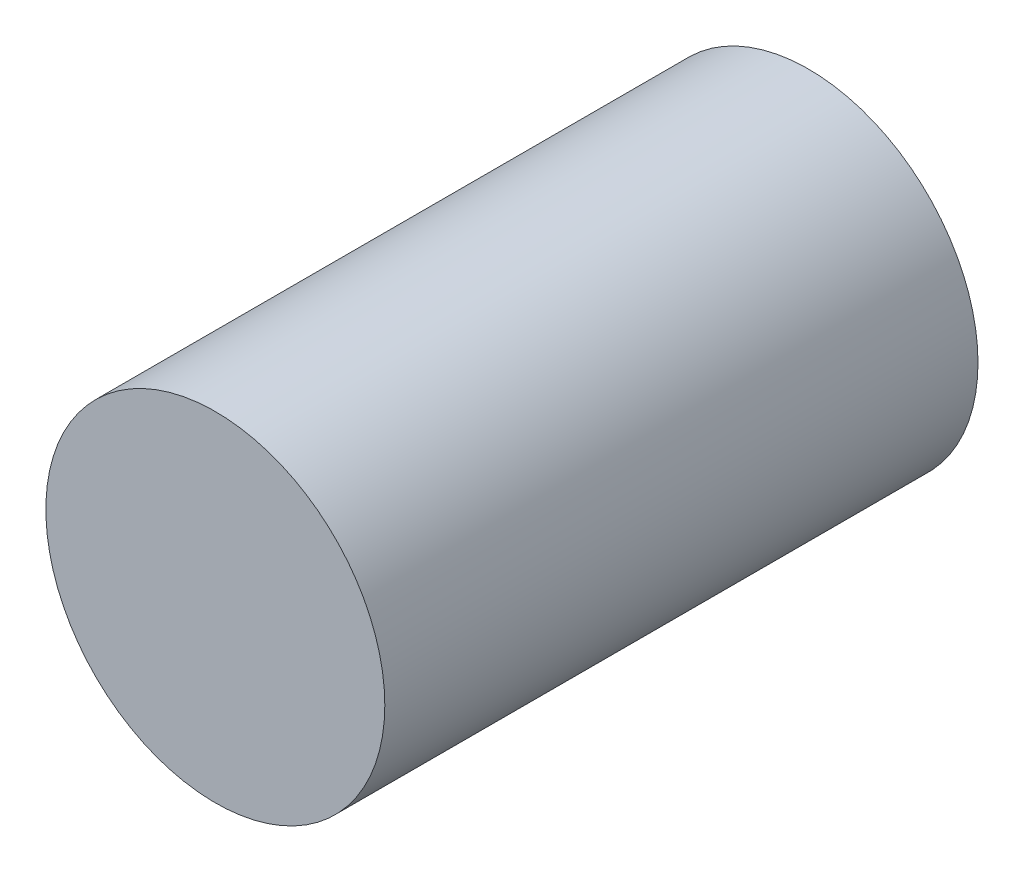
ISO-10303-21;
HEADER;
FILE_DESCRIPTION(('STEP AP214'),'2;1');
FILE_NAME('part.step','',(''),(''),'','','');
FILE_SCHEMA(('AUTOMOTIVE_DESIGN { 1 0 10303 214 1 1 1 1 }'));
ENDSEC;
DATA;
#1=APPLICATION_CONTEXT('core data for automotive mechanical design processes');
#2=APPLICATION_PROTOCOL_DEFINITION('international standard','automotive_design',2000,#1);
#3=PRODUCT_CONTEXT('',#1,'mechanical');
#4=PRODUCT('Part','Part','',(#3));
#5=PRODUCT_RELATED_PRODUCT_CATEGORY('part','',(#4));
#6=PRODUCT_DEFINITION_FORMATION('','',#4);
#7=PRODUCT_DEFINITION_CONTEXT('part definition',#1,'design');
#8=PRODUCT_DEFINITION('design','',#6,#7);
#9=PRODUCT_DEFINITION_SHAPE('','',#8);
#10=(LENGTH_UNIT() NAMED_UNIT(*) SI_UNIT(.MILLI.,.METRE.));
#11=(NAMED_UNIT(*) PLANE_ANGLE_UNIT() SI_UNIT($,.RADIAN.));
#12=(NAMED_UNIT(*) SI_UNIT($,.STERADIAN.) SOLID_ANGLE_UNIT());
#13=UNCERTAINTY_MEASURE_WITH_UNIT(LENGTH_MEASURE(1.E-05),#10,'distance_accuracy_value','');
#14=(GEOMETRIC_REPRESENTATION_CONTEXT(3) GLOBAL_UNCERTAINTY_ASSIGNED_CONTEXT((#13)) GLOBAL_UNIT_ASSIGNED_CONTEXT((#10,
#11,#12)) REPRESENTATION_CONTEXT('',''));
#15=CARTESIAN_POINT('',(0.,0.,0.));
#16=DIRECTION('',(0.,0.,1.));
#17=DIRECTION('',(1.,0.,0.));
#18=AXIS2_PLACEMENT_3D('',#15,#16,#17);
#19=CARTESIAN_POINT('',(0.,0.,35.));
#20=DIRECTION('',(0.,0.,-1.));
#21=DIRECTION('',(-1.,0.,0.));
#22=AXIS2_PLACEMENT_3D('',#19,#20,#21);
#23=CYLINDRICAL_SURFACE('',#22,10.);
#24=CARTESIAN_POINT('',(0.,0.,35.));
#25=DIRECTION('',(0.,0.,1.));
#26=DIRECTION('',(1.,0.,0.));
#27=AXIS2_PLACEMENT_3D('',#24,#25,#26);
#28=CIRCLE('',#27,10.);
#29=CARTESIAN_POINT('',(10.,0.,35.));
#30=VERTEX_POINT('',#29);
#31=EDGE_CURVE('E10',#30,#30,#28,.T.);
#32=ORIENTED_EDGE('',*,*,#31,.F.);
#33=EDGE_LOOP('',(#32));
#34=FACE_BOUND('',#33,.T.);
#35=CARTESIAN_POINT('',(0.,0.,0.));
#36=DIRECTION('',(0.,0.,1.));
#37=DIRECTION('',(1.,0.,0.));
#38=AXIS2_PLACEMENT_3D('',#35,#36,#37);
#39=CIRCLE('',#38,10.);
#40=CARTESIAN_POINT('',(10.,0.,0.));
#41=VERTEX_POINT('',#40);
#42=EDGE_CURVE('E34',#41,#41,#39,.T.);
#43=ORIENTED_EDGE('',*,*,#42,.T.);
#44=EDGE_LOOP('',(#43));
#45=FACE_BOUND('',#44,.T.);
#46=ADVANCED_FACE('F31',(#34,#45),#23,.T.);
#47=CARTESIAN_POINT('',(0.,0.,35.));
#48=DIRECTION('',(0.,0.,1.));
#49=DIRECTION('',(1.,0.,0.));
#50=AXIS2_PLACEMENT_3D('',#47,#48,#49);
#51=PLANE('',#50);
#52=ORIENTED_EDGE('',*,*,#31,.T.);
#53=EDGE_LOOP('',(#52));
#54=FACE_BOUND('',#53,.T.);
#55=ADVANCED_FACE('F60',(#54),#51,.T.);
#56=CARTESIAN_POINT('',(0.,0.,0.));
#57=DIRECTION('',(0.,0.,1.));
#58=DIRECTION('',(1.,0.,0.));
#59=AXIS2_PLACEMENT_3D('',#56,#57,#58);
#60=PLANE('',#59);
#61=CARTESIAN_POINT('',(0.,0.,0.));
#62=DIRECTION('',(0.,0.,-1.));
#63=DIRECTION('',(-1.,0.,0.));
#64=AXIS2_PLACEMENT_3D('',#61,#62,#63);
#65=CIRCLE('',#64,9.5);
#66=CARTESIAN_POINT('',(-9.5,0.,0.));
#67=VERTEX_POINT('',#66);
#68=EDGE_CURVE('E43',#67,#67,#65,.T.);
#69=ORIENTED_EDGE('',*,*,#68,.F.);
#70=EDGE_LOOP('',(#69));
#71=FACE_BOUND('',#70,.T.);
#72=ORIENTED_EDGE('',*,*,#42,.F.);
#73=EDGE_LOOP('',(#72));
#74=FACE_BOUND('',#73,.T.);
#75=ADVANCED_FACE('F54',(#71,#74),#60,.F.);
#76=CARTESIAN_POINT('',(0.,0.,20.));
#77=DIRECTION('',(0.,0.,-1.));
#78=DIRECTION('',(-1.,0.,0.));
#79=AXIS2_PLACEMENT_3D('',#76,#77,#78);
#80=CYLINDRICAL_SURFACE('',#79,9.5);
#81=CARTESIAN_POINT('',(0.,0.,20.));
#82=DIRECTION('',(0.,0.,-1.));
#83=DIRECTION('',(-1.,0.,0.));
#84=AXIS2_PLACEMENT_3D('',#81,#82,#83);
#85=CIRCLE('',#84,9.5);
#86=CARTESIAN_POINT('',(-9.5,0.,20.));
#87=VERTEX_POINT('',#86);
#88=EDGE_CURVE('E41',#87,#87,#85,.T.);
#89=ORIENTED_EDGE('',*,*,#88,.F.);
#90=EDGE_LOOP('',(#89));
#91=FACE_BOUND('',#90,.T.);
#92=ORIENTED_EDGE('',*,*,#68,.T.);
#93=EDGE_LOOP('',(#92));
#94=FACE_BOUND('',#93,.T.);
#95=ADVANCED_FACE('F51',(#91,#94),#80,.F.);
#96=CARTESIAN_POINT('',(0.,0.,20.));
#97=DIRECTION('',(0.,0.,-1.));
#98=DIRECTION('',(-1.,0.,0.));
#99=AXIS2_PLACEMENT_3D('',#96,#97,#98);
#100=PLANE('',#99);
#101=ORIENTED_EDGE('',*,*,#88,.T.);
#102=EDGE_LOOP('',(#101));
#103=FACE_BOUND('',#102,.T.);
#104=ADVANCED_FACE('F49',(#103),#100,.T.);
#105=CLOSED_SHELL('',(#46,#55,#75,#95,#104));
#106=MANIFOLD_SOLID_BREP('B2',#105);
#107=ADVANCED_BREP_SHAPE_REPRESENTATION('',(#18,#106),#14);
#108=SHAPE_DEFINITION_REPRESENTATION(#9,#107);
ENDSEC;
END-ISO-10303-21;
